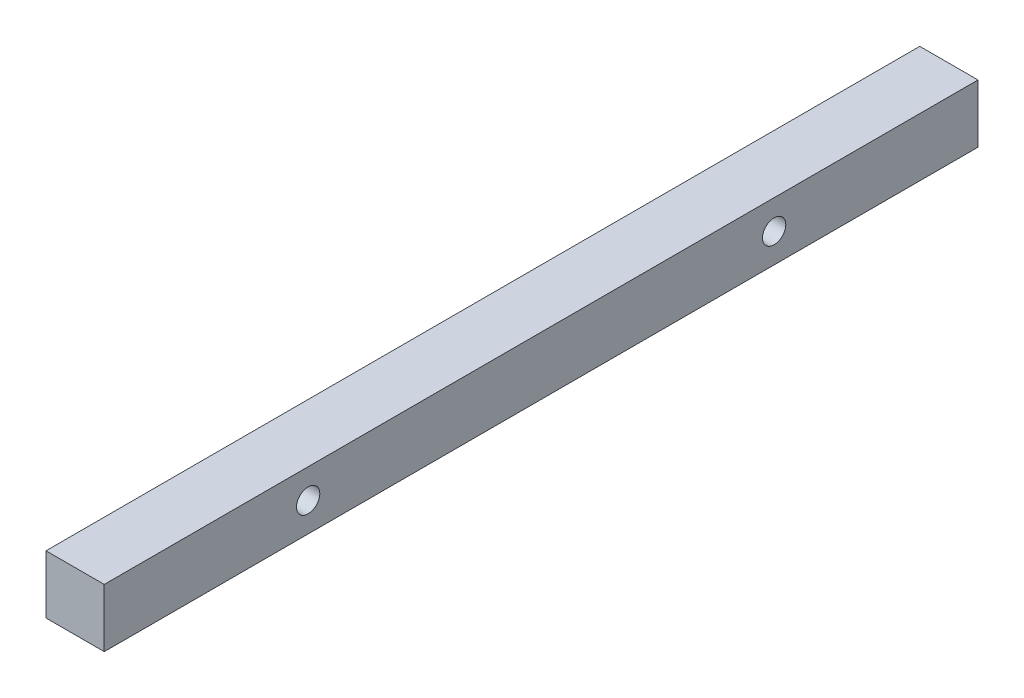
ISO-10303-21;
HEADER;
FILE_DESCRIPTION(('STEP AP214'),'2;1');
FILE_NAME('part.step','',(''),(''),'','','');
FILE_SCHEMA(('AUTOMOTIVE_DESIGN { 1 0 10303 214 1 1 1 1 }'));
ENDSEC;
DATA;
#1=APPLICATION_CONTEXT('core data for automotive mechanical design processes');
#2=APPLICATION_PROTOCOL_DEFINITION('international standard','automotive_design',2000,#1);
#3=PRODUCT_CONTEXT('',#1,'mechanical');
#4=PRODUCT('Part','Part','',(#3));
#5=PRODUCT_RELATED_PRODUCT_CATEGORY('part','',(#4));
#6=PRODUCT_DEFINITION_FORMATION('','',#4);
#7=PRODUCT_DEFINITION_CONTEXT('part definition',#1,'design');
#8=PRODUCT_DEFINITION('design','',#6,#7);
#9=PRODUCT_DEFINITION_SHAPE('','',#8);
#10=(LENGTH_UNIT() NAMED_UNIT(*) SI_UNIT(.MILLI.,.METRE.));
#11=(NAMED_UNIT(*) PLANE_ANGLE_UNIT() SI_UNIT($,.RADIAN.));
#12=(NAMED_UNIT(*) SI_UNIT($,.STERADIAN.) SOLID_ANGLE_UNIT());
#13=UNCERTAINTY_MEASURE_WITH_UNIT(LENGTH_MEASURE(1.E-05),#10,'distance_accuracy_value','');
#14=(GEOMETRIC_REPRESENTATION_CONTEXT(3) GLOBAL_UNCERTAINTY_ASSIGNED_CONTEXT((#13)) GLOBAL_UNIT_ASSIGNED_CONTEXT((#10,
#11,#12)) REPRESENTATION_CONTEXT('',''));
#15=CARTESIAN_POINT('',(0.,0.,0.));
#16=DIRECTION('',(0.,0.,1.));
#17=DIRECTION('',(1.,0.,0.));
#18=AXIS2_PLACEMENT_3D('',#15,#16,#17);
#19=CARTESIAN_POINT('',(10.,-10.,150.));
#20=DIRECTION('',(-1.,0.,0.));
#21=DIRECTION('',(0.,0.,1.));
#22=AXIS2_PLACEMENT_3D('',#19,#20,#21);
#23=PLANE('',#22);
#24=CARTESIAN_POINT('',(10.,0.,-80.));
#25=DIRECTION('',(-1.,0.,0.));
#26=DIRECTION('',(0.,0.,-1.));
#27=AXIS2_PLACEMENT_3D('',#24,#25,#26);
#28=CIRCLE('',#27,4.00000000000001);
#29=CARTESIAN_POINT('',(10.,0.,-84.));
#30=VERTEX_POINT('',#29);
#31=EDGE_CURVE('E131',#30,#30,#28,.T.);
#32=ORIENTED_EDGE('',*,*,#31,.T.);
#33=EDGE_LOOP('',(#32));
#34=FACE_BOUND('',#33,.T.);
#35=CARTESIAN_POINT('',(10.,0.,80.));
#36=DIRECTION('',(-1.,0.,0.));
#37=DIRECTION('',(0.,0.,1.));
#38=AXIS2_PLACEMENT_3D('',#35,#36,#37);
#39=CIRCLE('',#38,4.00000000000001);
#40=CARTESIAN_POINT('',(10.,0.,84.));
#41=VERTEX_POINT('',#40);
#42=EDGE_CURVE('E125',#41,#41,#39,.T.);
#43=ORIENTED_EDGE('',*,*,#42,.T.);
#44=EDGE_LOOP('',(#43));
#45=FACE_BOUND('',#44,.T.);
#46=DIRECTION('',(0.,1.,0.));
#47=VECTOR('',#46,1.);
#48=CARTESIAN_POINT('',(10.,-10.,-150.));
#49=LINE('',#48,#47);
#50=CARTESIAN_POINT('',(10.,-10.,-150.));
#51=VERTEX_POINT('',#50);
#52=CARTESIAN_POINT('',(10.,10.,-150.));
#53=VERTEX_POINT('',#52);
#54=EDGE_CURVE('E96',#51,#53,#49,.T.);
#55=ORIENTED_EDGE('',*,*,#54,.T.);
#56=DIRECTION('',(0.,0.,-1.));
#57=VECTOR('',#56,1.);
#58=CARTESIAN_POINT('',(10.,10.,150.));
#59=LINE('',#58,#57);
#60=CARTESIAN_POINT('',(10.,10.,150.));
#61=VERTEX_POINT('',#60);
#62=EDGE_CURVE('E11',#61,#53,#59,.T.);
#63=ORIENTED_EDGE('',*,*,#62,.F.);
#64=DIRECTION('',(0.,1.,0.));
#65=VECTOR('',#64,1.);
#66=CARTESIAN_POINT('',(10.,-10.,150.));
#67=LINE('',#66,#65);
#68=CARTESIAN_POINT('',(10.,-10.,150.));
#69=VERTEX_POINT('',#68);
#70=EDGE_CURVE('E84',#69,#61,#67,.T.);
#71=ORIENTED_EDGE('',*,*,#70,.F.);
#72=DIRECTION('',(0.,0.,-1.));
#73=VECTOR('',#72,1.);
#74=CARTESIAN_POINT('',(10.,-10.,150.));
#75=LINE('',#74,#73);
#76=EDGE_CURVE('E92',#69,#51,#75,.T.);
#77=ORIENTED_EDGE('',*,*,#76,.T.);
#78=EDGE_LOOP('',(#55,#63,#71,#77));
#79=FACE_BOUND('',#78,.T.);
#80=ADVANCED_FACE('F33',(#34,#45,#79),#23,.F.);
#81=CARTESIAN_POINT('',(-9.99999999999999,10.,150.));
#82=DIRECTION('',(0.,-1.,0.));
#83=DIRECTION('',(0.,0.,-1.));
#84=AXIS2_PLACEMENT_3D('',#81,#82,#83);
#85=PLANE('',#84);
#86=DIRECTION('',(-1.,0.,0.));
#87=VECTOR('',#86,1.);
#88=CARTESIAN_POINT('',(-9.99999999999999,10.,-150.));
#89=LINE('',#88,#87);
#90=CARTESIAN_POINT('',(-9.99999999999999,10.,-150.));
#91=VERTEX_POINT('',#90);
#92=EDGE_CURVE('E88',#53,#91,#89,.T.);
#93=ORIENTED_EDGE('',*,*,#92,.T.);
#94=DIRECTION('',(0.,0.,-1.));
#95=VECTOR('',#94,1.);
#96=CARTESIAN_POINT('',(-9.99999999999999,10.,150.));
#97=LINE('',#96,#95);
#98=CARTESIAN_POINT('',(-9.99999999999999,10.,150.));
#99=VERTEX_POINT('',#98);
#100=EDGE_CURVE('E41',#99,#91,#97,.T.);
#101=ORIENTED_EDGE('',*,*,#100,.F.);
#102=DIRECTION('',(-1.,0.,0.));
#103=VECTOR('',#102,1.);
#104=CARTESIAN_POINT('',(-9.99999999999999,10.,150.));
#105=LINE('',#104,#103);
#106=EDGE_CURVE('E79',#61,#99,#105,.T.);
#107=ORIENTED_EDGE('',*,*,#106,.F.);
#108=ORIENTED_EDGE('',*,*,#62,.T.);
#109=EDGE_LOOP('',(#93,#101,#107,#108));
#110=FACE_BOUND('',#109,.T.);
#111=ADVANCED_FACE('F87',(#110),#85,.F.);
#112=CARTESIAN_POINT('',(-9.99999999999999,-10.,150.));
#113=DIRECTION('',(1.,0.,0.));
#114=DIRECTION('',(0.,0.,-1.));
#115=AXIS2_PLACEMENT_3D('',#112,#113,#114);
#116=PLANE('',#115);
#117=CARTESIAN_POINT('',(-9.99999999999999,0.,-80.));
#118=DIRECTION('',(-1.,0.,0.));
#119=DIRECTION('',(0.,0.,-1.));
#120=AXIS2_PLACEMENT_3D('',#117,#118,#119);
#121=CIRCLE('',#120,4.00000000000001);
#122=CARTESIAN_POINT('',(-9.99999999999999,0.,-84.));
#123=VERTEX_POINT('',#122);
#124=EDGE_CURVE('E134',#123,#123,#121,.T.);
#125=ORIENTED_EDGE('',*,*,#124,.F.);
#126=EDGE_LOOP('',(#125));
#127=FACE_BOUND('',#126,.T.);
#128=CARTESIAN_POINT('',(-9.99999999999999,0.,80.));
#129=DIRECTION('',(-1.,0.,0.));
#130=DIRECTION('',(0.,0.,1.));
#131=AXIS2_PLACEMENT_3D('',#128,#129,#130);
#132=CIRCLE('',#131,4.00000000000001);
#133=CARTESIAN_POINT('',(-9.99999999999999,0.,84.));
#134=VERTEX_POINT('',#133);
#135=EDGE_CURVE('E128',#134,#134,#132,.T.);
#136=ORIENTED_EDGE('',*,*,#135,.F.);
#137=EDGE_LOOP('',(#136));
#138=FACE_BOUND('',#137,.T.);
#139=CARTESIAN_POINT('',(-9.99999999999999,0.,140.));
#140=DIRECTION('',(1.,0.,0.));
#141=DIRECTION('',(0.,0.,1.));
#142=AXIS2_PLACEMENT_3D('',#139,#140,#141);
#143=CIRCLE('',#142,2.5);
#144=CARTESIAN_POINT('',(-9.99999999999999,0.,142.5));
#145=VERTEX_POINT('',#144);
#146=EDGE_CURVE('E119',#145,#145,#143,.T.);
#147=ORIENTED_EDGE('',*,*,#146,.T.);
#148=EDGE_LOOP('',(#147));
#149=FACE_BOUND('',#148,.T.);
#150=CARTESIAN_POINT('',(-9.99999999999999,0.,-140.));
#151=DIRECTION('',(1.,0.,0.));
#152=DIRECTION('',(0.,0.,-1.));
#153=AXIS2_PLACEMENT_3D('',#150,#151,#152);
#154=CIRCLE('',#153,2.5);
#155=CARTESIAN_POINT('',(-9.99999999999999,0.,-142.5));
#156=VERTEX_POINT('',#155);
#157=EDGE_CURVE('E113',#156,#156,#154,.T.);
#158=ORIENTED_EDGE('',*,*,#157,.T.);
#159=EDGE_LOOP('',(#158));
#160=FACE_BOUND('',#159,.T.);
#161=CARTESIAN_POINT('',(-9.99999999999999,0.,0.));
#162=DIRECTION('',(1.,0.,0.));
#163=DIRECTION('',(0.,0.,-1.));
#164=AXIS2_PLACEMENT_3D('',#161,#162,#163);
#165=CIRCLE('',#164,2.5);
#166=CARTESIAN_POINT('',(-9.99999999999999,0.,-2.5));
#167=VERTEX_POINT('',#166);
#168=EDGE_CURVE('E99',#167,#167,#165,.T.);
#169=ORIENTED_EDGE('',*,*,#168,.T.);
#170=EDGE_LOOP('',(#169));
#171=FACE_BOUND('',#170,.T.);
#172=DIRECTION('',(0.,-1.,0.));
#173=VECTOR('',#172,1.);
#174=CARTESIAN_POINT('',(-9.99999999999999,-10.,-150.));
#175=LINE('',#174,#173);
#176=CARTESIAN_POINT('',(-9.99999999999999,-10.,-150.));
#177=VERTEX_POINT('',#176);
#178=EDGE_CURVE('E66',#91,#177,#175,.T.);
#179=ORIENTED_EDGE('',*,*,#178,.T.);
#180=DIRECTION('',(0.,0.,-1.));
#181=VECTOR('',#180,1.);
#182=CARTESIAN_POINT('',(-9.99999999999999,-10.,150.));
#183=LINE('',#182,#181);
#184=CARTESIAN_POINT('',(-9.99999999999999,-10.,150.));
#185=VERTEX_POINT('',#184);
#186=EDGE_CURVE('E89',#185,#177,#183,.T.);
#187=ORIENTED_EDGE('',*,*,#186,.F.);
#188=DIRECTION('',(0.,-1.,0.));
#189=VECTOR('',#188,1.);
#190=CARTESIAN_POINT('',(-9.99999999999999,-10.,150.));
#191=LINE('',#190,#189);
#192=EDGE_CURVE('E82',#99,#185,#191,.T.);
#193=ORIENTED_EDGE('',*,*,#192,.F.);
#194=ORIENTED_EDGE('',*,*,#100,.T.);
#195=EDGE_LOOP('',(#179,#187,#193,#194));
#196=FACE_BOUND('',#195,.T.);
#197=ADVANCED_FACE('F90',(#127,#138,#149,#160,#171,#196),#116,.F.);
#198=CARTESIAN_POINT('',(-9.99999999999999,-10.,150.));
#199=DIRECTION('',(0.,1.,0.));
#200=DIRECTION('',(0.,0.,1.));
#201=AXIS2_PLACEMENT_3D('',#198,#199,#200);
#202=PLANE('',#201);
#203=DIRECTION('',(1.,0.,0.));
#204=VECTOR('',#203,1.);
#205=CARTESIAN_POINT('',(-9.99999999999999,-10.,-150.));
#206=LINE('',#205,#204);
#207=EDGE_CURVE('E72',#177,#51,#206,.T.);
#208=ORIENTED_EDGE('',*,*,#207,.T.);
#209=ORIENTED_EDGE('',*,*,#76,.F.);
#210=DIRECTION('',(1.,0.,0.));
#211=VECTOR('',#210,1.);
#212=CARTESIAN_POINT('',(-9.99999999999999,-10.,150.));
#213=LINE('',#212,#211);
#214=EDGE_CURVE('E49',#185,#69,#213,.T.);
#215=ORIENTED_EDGE('',*,*,#214,.F.);
#216=ORIENTED_EDGE('',*,*,#186,.T.);
#217=EDGE_LOOP('',(#208,#209,#215,#216));
#218=FACE_BOUND('',#217,.T.);
#219=ADVANCED_FACE('F104',(#218),#202,.F.);
#220=CARTESIAN_POINT('',(0.,0.,150.));
#221=DIRECTION('',(0.,0.,-1.));
#222=DIRECTION('',(-1.,0.,0.));
#223=AXIS2_PLACEMENT_3D('',#220,#221,#222);
#224=PLANE('',#223);
#225=ORIENTED_EDGE('',*,*,#70,.T.);
#226=ORIENTED_EDGE('',*,*,#106,.T.);
#227=ORIENTED_EDGE('',*,*,#192,.T.);
#228=ORIENTED_EDGE('',*,*,#214,.T.);
#229=EDGE_LOOP('',(#225,#226,#227,#228));
#230=FACE_BOUND('',#229,.T.);
#231=ADVANCED_FACE('F80',(#230),#224,.F.);
#232=CARTESIAN_POINT('',(0.,0.,-150.));
#233=DIRECTION('',(0.,0.,-1.));
#234=DIRECTION('',(-1.,0.,0.));
#235=AXIS2_PLACEMENT_3D('',#232,#233,#234);
#236=PLANE('',#235);
#237=ORIENTED_EDGE('',*,*,#54,.F.);
#238=ORIENTED_EDGE('',*,*,#207,.F.);
#239=ORIENTED_EDGE('',*,*,#178,.F.);
#240=ORIENTED_EDGE('',*,*,#92,.F.);
#241=EDGE_LOOP('',(#237,#238,#239,#240));
#242=FACE_BOUND('',#241,.T.);
#243=ADVANCED_FACE('F107',(#242),#236,.T.);
#244=CARTESIAN_POINT('',(-9.99999999999999,0.,0.));
#245=DIRECTION('',(1.,0.,0.));
#246=DIRECTION('',(0.,0.,-1.));
#247=AXIS2_PLACEMENT_3D('',#244,#245,#246);
#248=CYLINDRICAL_SURFACE('',#247,2.5);
#249=ORIENTED_EDGE('',*,*,#168,.F.);
#250=EDGE_LOOP('',(#249));
#251=FACE_BOUND('',#250,.T.);
#252=CARTESIAN_POINT('',(0.,0.,0.));
#253=DIRECTION('',(1.,0.,0.));
#254=DIRECTION('',(0.,0.,-1.));
#255=AXIS2_PLACEMENT_3D('',#252,#253,#254);
#256=CIRCLE('',#255,2.5);
#257=CARTESIAN_POINT('',(0.,0.,-2.5));
#258=VERTEX_POINT('',#257);
#259=EDGE_CURVE('E110',#258,#258,#256,.T.);
#260=ORIENTED_EDGE('',*,*,#259,.T.);
#261=EDGE_LOOP('',(#260));
#262=FACE_BOUND('',#261,.T.);
#263=ADVANCED_FACE('F160',(#251,#262),#248,.F.);
#264=CARTESIAN_POINT('',(0.,0.,0.));
#265=DIRECTION('',(1.,0.,0.));
#266=DIRECTION('',(0.,0.,-1.));
#267=AXIS2_PLACEMENT_3D('',#264,#265,#266);
#268=PLANE('',#267);
#269=ORIENTED_EDGE('',*,*,#259,.F.);
#270=EDGE_LOOP('',(#269));
#271=FACE_BOUND('',#270,.T.);
#272=ADVANCED_FACE('F163',(#271),#268,.F.);
#273=CARTESIAN_POINT('',(-9.99999999999999,0.,-140.));
#274=DIRECTION('',(1.,0.,0.));
#275=DIRECTION('',(0.,0.,-1.));
#276=AXIS2_PLACEMENT_3D('',#273,#274,#275);
#277=CYLINDRICAL_SURFACE('',#276,2.5);
#278=ORIENTED_EDGE('',*,*,#157,.F.);
#279=EDGE_LOOP('',(#278));
#280=FACE_BOUND('',#279,.T.);
#281=CARTESIAN_POINT('',(0.,0.,-140.));
#282=DIRECTION('',(1.,0.,0.));
#283=DIRECTION('',(0.,0.,-1.));
#284=AXIS2_PLACEMENT_3D('',#281,#282,#283);
#285=CIRCLE('',#284,2.5);
#286=CARTESIAN_POINT('',(0.,0.,-142.5));
#287=VERTEX_POINT('',#286);
#288=EDGE_CURVE('E116',#287,#287,#285,.T.);
#289=ORIENTED_EDGE('',*,*,#288,.T.);
#290=EDGE_LOOP('',(#289));
#291=FACE_BOUND('',#290,.T.);
#292=ADVANCED_FACE('F168',(#280,#291),#277,.F.);
#293=CARTESIAN_POINT('',(0.,0.,-140.));
#294=DIRECTION('',(1.,0.,0.));
#295=DIRECTION('',(0.,0.,-1.));
#296=AXIS2_PLACEMENT_3D('',#293,#294,#295);
#297=PLANE('',#296);
#298=ORIENTED_EDGE('',*,*,#288,.F.);
#299=EDGE_LOOP('',(#298));
#300=FACE_BOUND('',#299,.T.);
#301=ADVANCED_FACE('F173',(#300),#297,.F.);
#302=CARTESIAN_POINT('',(-9.99999999999999,0.,140.));
#303=DIRECTION('',(1.,0.,0.));
#304=DIRECTION('',(0.,0.,-1.));
#305=AXIS2_PLACEMENT_3D('',#302,#303,#304);
#306=CYLINDRICAL_SURFACE('',#305,2.5);
#307=ORIENTED_EDGE('',*,*,#146,.F.);
#308=EDGE_LOOP('',(#307));
#309=FACE_BOUND('',#308,.T.);
#310=CARTESIAN_POINT('',(0.,0.,140.));
#311=DIRECTION('',(1.,0.,0.));
#312=DIRECTION('',(0.,0.,1.));
#313=AXIS2_PLACEMENT_3D('',#310,#311,#312);
#314=CIRCLE('',#313,2.5);
#315=CARTESIAN_POINT('',(0.,0.,142.5));
#316=VERTEX_POINT('',#315);
#317=EDGE_CURVE('E122',#316,#316,#314,.T.);
#318=ORIENTED_EDGE('',*,*,#317,.T.);
#319=EDGE_LOOP('',(#318));
#320=FACE_BOUND('',#319,.T.);
#321=ADVANCED_FACE('F219',(#309,#320),#306,.F.);
#322=CARTESIAN_POINT('',(0.,0.,140.));
#323=DIRECTION('',(-1.,0.,0.));
#324=DIRECTION('',(0.,0.,1.));
#325=AXIS2_PLACEMENT_3D('',#322,#323,#324);
#326=PLANE('',#325);
#327=ORIENTED_EDGE('',*,*,#317,.F.);
#328=EDGE_LOOP('',(#327));
#329=FACE_BOUND('',#328,.T.);
#330=ADVANCED_FACE('F229',(#329),#326,.T.);
#331=CARTESIAN_POINT('',(10.,0.,80.));
#332=DIRECTION('',(-1.,0.,0.));
#333=DIRECTION('',(0.,0.,1.));
#334=AXIS2_PLACEMENT_3D('',#331,#332,#333);
#335=CYLINDRICAL_SURFACE('',#334,4.00000000000001);
#336=ORIENTED_EDGE('',*,*,#42,.F.);
#337=EDGE_LOOP('',(#336));
#338=FACE_BOUND('',#337,.T.);
#339=ORIENTED_EDGE('',*,*,#135,.T.);
#340=EDGE_LOOP('',(#339));
#341=FACE_BOUND('',#340,.T.);
#342=ADVANCED_FACE('F145',(#338,#341),#335,.F.);
#343=CARTESIAN_POINT('',(10.,0.,-80.));
#344=DIRECTION('',(-1.,0.,0.));
#345=DIRECTION('',(0.,0.,1.));
#346=AXIS2_PLACEMENT_3D('',#343,#344,#345);
#347=CYLINDRICAL_SURFACE('',#346,4.00000000000001);
#348=ORIENTED_EDGE('',*,*,#31,.F.);
#349=EDGE_LOOP('',(#348));
#350=FACE_BOUND('',#349,.T.);
#351=ORIENTED_EDGE('',*,*,#124,.T.);
#352=EDGE_LOOP('',(#351));
#353=FACE_BOUND('',#352,.T.);
#354=ADVANCED_FACE('F142',(#350,#353),#347,.F.);
#355=CLOSED_SHELL('',(#80,#111,#197,#219,#231,#243,#263,#272,#292,#301,#321,#330,#342,#354));
#356=MANIFOLD_SOLID_BREP('B2',#355);
#357=ADVANCED_BREP_SHAPE_REPRESENTATION('',(#18,#356),#14);
#358=SHAPE_DEFINITION_REPRESENTATION(#9,#357);
ENDSEC;
END-ISO-10303-21;
